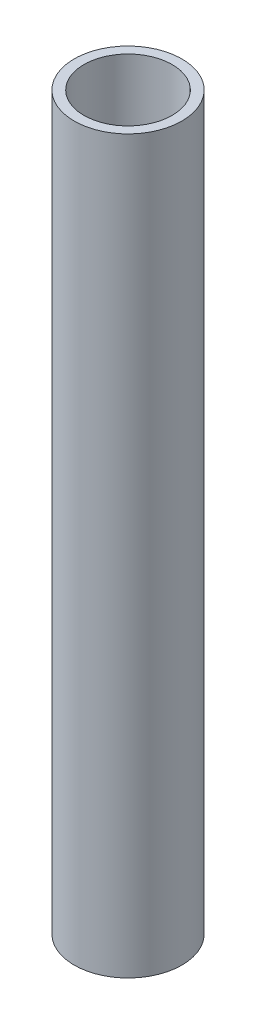
ISO-10303-21;
HEADER;
FILE_DESCRIPTION(('STEP AP214'),'2;1');
FILE_NAME('part.step','',(''),(''),'','','');
FILE_SCHEMA(('AUTOMOTIVE_DESIGN { 1 0 10303 214 1 1 1 1 }'));
ENDSEC;
DATA;
#1=APPLICATION_CONTEXT('core data for automotive mechanical design processes');
#2=APPLICATION_PROTOCOL_DEFINITION('international standard','automotive_design',2000,#1);
#3=PRODUCT_CONTEXT('',#1,'mechanical');
#4=PRODUCT('Part','Part','',(#3));
#5=PRODUCT_RELATED_PRODUCT_CATEGORY('part','',(#4));
#6=PRODUCT_DEFINITION_FORMATION('','',#4);
#7=PRODUCT_DEFINITION_CONTEXT('part definition',#1,'design');
#8=PRODUCT_DEFINITION('design','',#6,#7);
#9=PRODUCT_DEFINITION_SHAPE('','',#8);
#10=(LENGTH_UNIT() NAMED_UNIT(*) SI_UNIT(.MILLI.,.METRE.));
#11=(NAMED_UNIT(*) PLANE_ANGLE_UNIT() SI_UNIT($,.RADIAN.));
#12=(NAMED_UNIT(*) SI_UNIT($,.STERADIAN.) SOLID_ANGLE_UNIT());
#13=UNCERTAINTY_MEASURE_WITH_UNIT(LENGTH_MEASURE(1.E-05),#10,'distance_accuracy_value','');
#14=(GEOMETRIC_REPRESENTATION_CONTEXT(3) GLOBAL_UNCERTAINTY_ASSIGNED_CONTEXT((#13)) GLOBAL_UNIT_ASSIGNED_CONTEXT((#10,
#11,#12)) REPRESENTATION_CONTEXT('',''));
#15=CARTESIAN_POINT('',(0.,0.,0.));
#16=DIRECTION('',(0.,0.,1.));
#17=DIRECTION('',(1.,0.,0.));
#18=AXIS2_PLACEMENT_3D('',#15,#16,#17);
#19=CARTESIAN_POINT('',(0.699999999999995,27.4526670338006,-1.6));
#20=DIRECTION('',(0.,-1.,0.));
#21=DIRECTION('',(1.,0.,0.));
#22=AXIS2_PLACEMENT_3D('',#19,#20,#21);
#23=PLANE('',#22);
#24=CARTESIAN_POINT('',(0.699999999999995,27.4526670338006,-1.6));
#25=DIRECTION('',(0.,-1.,0.));
#26=DIRECTION('',(1.,0.,0.));
#27=AXIS2_PLACEMENT_3D('',#24,#25,#26);
#28=CIRCLE('',#27,0.7366);
#29=CARTESIAN_POINT('',(1.43659999999999,27.4526670338006,-1.6));
#30=VERTEX_POINT('',#29);
#31=EDGE_CURVE('E10',#30,#30,#28,.T.);
#32=ORIENTED_EDGE('',*,*,#31,.T.);
#33=EDGE_LOOP('',(#32));
#34=FACE_BOUND('',#33,.T.);
#35=CARTESIAN_POINT('',(0.699999999999995,27.4526670338006,-1.6));
#36=DIRECTION('',(0.,-1.,0.));
#37=DIRECTION('',(1.,0.,0.));
#38=AXIS2_PLACEMENT_3D('',#35,#36,#37);
#39=CIRCLE('',#38,0.60325);
#40=CARTESIAN_POINT('',(1.30324999999999,27.4526670338006,-1.6));
#41=VERTEX_POINT('',#40);
#42=EDGE_CURVE('E43',#41,#41,#39,.T.);
#43=ORIENTED_EDGE('',*,*,#42,.F.);
#44=EDGE_LOOP('',(#43));
#45=FACE_BOUND('',#44,.T.);
#46=ADVANCED_FACE('F32',(#34,#45),#23,.T.);
#47=CARTESIAN_POINT('',(0.699999999999994,37.4526670338006,-1.6));
#48=DIRECTION('',(0.,-1.,0.));
#49=DIRECTION('',(1.,0.,0.));
#50=AXIS2_PLACEMENT_3D('',#47,#48,#49);
#51=PLANE('',#50);
#52=CARTESIAN_POINT('',(0.699999999999994,37.4526670338006,-1.6));
#53=DIRECTION('',(0.,-1.,0.));
#54=DIRECTION('',(1.,0.,0.));
#55=AXIS2_PLACEMENT_3D('',#52,#53,#54);
#56=CIRCLE('',#55,0.7366);
#57=CARTESIAN_POINT('',(1.43659999999999,37.4526670338006,-1.6));
#58=VERTEX_POINT('',#57);
#59=EDGE_CURVE('E36',#58,#58,#56,.T.);
#60=ORIENTED_EDGE('',*,*,#59,.F.);
#61=EDGE_LOOP('',(#60));
#62=FACE_BOUND('',#61,.T.);
#63=CARTESIAN_POINT('',(0.699999999999994,37.4526670338006,-1.6));
#64=DIRECTION('',(0.,-1.,0.));
#65=DIRECTION('',(1.,0.,0.));
#66=AXIS2_PLACEMENT_3D('',#63,#64,#65);
#67=CIRCLE('',#66,0.60325);
#68=CARTESIAN_POINT('',(1.30324999999999,37.4526670338006,-1.6));
#69=VERTEX_POINT('',#68);
#70=EDGE_CURVE('E45',#69,#69,#67,.T.);
#71=ORIENTED_EDGE('',*,*,#70,.T.);
#72=EDGE_LOOP('',(#71));
#73=FACE_BOUND('',#72,.T.);
#74=ADVANCED_FACE('F55',(#62,#73),#51,.F.);
#75=CARTESIAN_POINT('',(0.699999999999995,27.4526670338006,-1.6));
#76=DIRECTION('',(0.,1.,0.));
#77=DIRECTION('',(-1.,0.,0.));
#78=AXIS2_PLACEMENT_3D('',#75,#76,#77);
#79=CYLINDRICAL_SURFACE('',#78,0.7366);
#80=ORIENTED_EDGE('',*,*,#31,.F.);
#81=EDGE_LOOP('',(#80));
#82=FACE_BOUND('',#81,.T.);
#83=ORIENTED_EDGE('',*,*,#59,.T.);
#84=EDGE_LOOP('',(#83));
#85=FACE_BOUND('',#84,.T.);
#86=ADVANCED_FACE('F34',(#82,#85),#79,.T.);
#87=CARTESIAN_POINT('',(0.699999999999995,27.4526670338006,-1.6));
#88=DIRECTION('',(0.,1.,0.));
#89=DIRECTION('',(-1.,0.,0.));
#90=AXIS2_PLACEMENT_3D('',#87,#88,#89);
#91=CYLINDRICAL_SURFACE('',#90,0.60325);
#92=ORIENTED_EDGE('',*,*,#42,.T.);
#93=EDGE_LOOP('',(#92));
#94=FACE_BOUND('',#93,.T.);
#95=ORIENTED_EDGE('',*,*,#70,.F.);
#96=EDGE_LOOP('',(#95));
#97=FACE_BOUND('',#96,.T.);
#98=ADVANCED_FACE('F51',(#94,#97),#91,.F.);
#99=CLOSED_SHELL('',(#46,#74,#86,#98));
#100=MANIFOLD_SOLID_BREP('B2',#99);
#101=ADVANCED_BREP_SHAPE_REPRESENTATION('',(#18,#100),#14);
#102=SHAPE_DEFINITION_REPRESENTATION(#9,#101);
ENDSEC;
END-ISO-10303-21;
